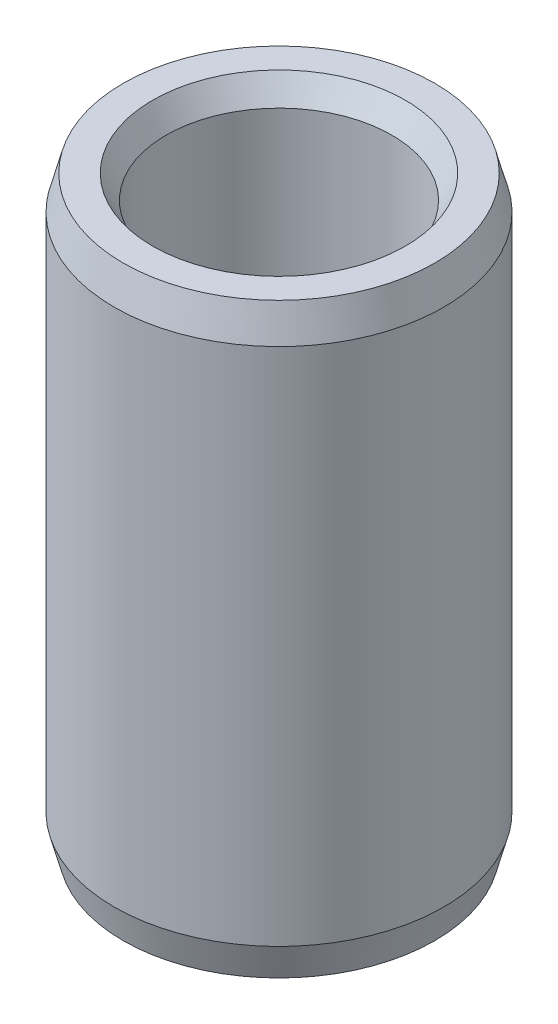
ISO-10303-21;
HEADER;
FILE_DESCRIPTION(('STEP AP214'),'2;1');
FILE_NAME('part.step','',(''),(''),'','','');
FILE_SCHEMA(('AUTOMOTIVE_DESIGN { 1 0 10303 214 1 1 1 1 }'));
ENDSEC;
DATA;
#1=APPLICATION_CONTEXT('core data for automotive mechanical design processes');
#2=APPLICATION_PROTOCOL_DEFINITION('international standard','automotive_design',2000,#1);
#3=PRODUCT_CONTEXT('',#1,'mechanical');
#4=PRODUCT('Part','Part','',(#3));
#5=PRODUCT_RELATED_PRODUCT_CATEGORY('part','',(#4));
#6=PRODUCT_DEFINITION_FORMATION('','',#4);
#7=PRODUCT_DEFINITION_CONTEXT('part definition',#1,'design');
#8=PRODUCT_DEFINITION('design','',#6,#7);
#9=PRODUCT_DEFINITION_SHAPE('','',#8);
#10=(LENGTH_UNIT() NAMED_UNIT(*) SI_UNIT(.MILLI.,.METRE.));
#11=(NAMED_UNIT(*) PLANE_ANGLE_UNIT() SI_UNIT($,.RADIAN.));
#12=(NAMED_UNIT(*) SI_UNIT($,.STERADIAN.) SOLID_ANGLE_UNIT());
#13=UNCERTAINTY_MEASURE_WITH_UNIT(LENGTH_MEASURE(1.E-05),#10,'distance_accuracy_value','');
#14=(GEOMETRIC_REPRESENTATION_CONTEXT(3) GLOBAL_UNCERTAINTY_ASSIGNED_CONTEXT((#13)) GLOBAL_UNIT_ASSIGNED_CONTEXT((#10,
#11,#12)) REPRESENTATION_CONTEXT('',''));
#15=CARTESIAN_POINT('',(0.,0.,0.));
#16=DIRECTION('',(0.,0.,1.));
#17=DIRECTION('',(1.,0.,0.));
#18=AXIS2_PLACEMENT_3D('',#15,#16,#17);
#19=CARTESIAN_POINT('',(0.,-130.,0.));
#20=DIRECTION('',(0.,1.,0.));
#21=DIRECTION('',(0.,0.,1.));
#22=AXIS2_PLACEMENT_3D('',#19,#20,#21);
#23=CYLINDRICAL_SURFACE('',#22,36.5);
#24=CARTESIAN_POINT('',(0.,-7.46410161513802,0.));
#25=DIRECTION('',(0.,1.,0.));
#26=DIRECTION('',(0.,0.,1.));
#27=AXIS2_PLACEMENT_3D('',#24,#25,#26);
#28=CIRCLE('',#27,36.5);
#29=CARTESIAN_POINT('',(0.,-7.46410161513802,36.5));
#30=VERTEX_POINT('',#29);
#31=EDGE_CURVE('E10',#30,#30,#28,.F.);
#32=ORIENTED_EDGE('',*,*,#31,.T.);
#33=EDGE_LOOP('',(#32));
#34=FACE_BOUND('',#33,.T.);
#35=CARTESIAN_POINT('',(0.,-122.535898384862,0.));
#36=DIRECTION('',(0.,1.,0.));
#37=DIRECTION('',(0.,0.,1.));
#38=AXIS2_PLACEMENT_3D('',#35,#36,#37);
#39=CIRCLE('',#38,36.5);
#40=CARTESIAN_POINT('',(0.,-122.535898384862,36.5));
#41=VERTEX_POINT('',#40);
#42=EDGE_CURVE('E55',#41,#41,#39,.T.);
#43=ORIENTED_EDGE('',*,*,#42,.T.);
#44=EDGE_LOOP('',(#43));
#45=FACE_BOUND('',#44,.T.);
#46=ADVANCED_FACE('F39',(#34,#45),#23,.T.);
#47=CARTESIAN_POINT('',(0.,-130.,0.));
#48=DIRECTION('',(0.,1.,0.));
#49=DIRECTION('',(0.,0.,1.));
#50=AXIS2_PLACEMENT_3D('',#47,#48,#49);
#51=PLANE('',#50);
#52=CARTESIAN_POINT('',(0.,-130.,0.));
#53=DIRECTION('',(0.,1.,0.));
#54=DIRECTION('',(0.,0.,1.));
#55=AXIS2_PLACEMENT_3D('',#52,#53,#54);
#56=CIRCLE('',#55,34.5);
#57=CARTESIAN_POINT('',(0.,-130.,34.5));
#58=VERTEX_POINT('',#57);
#59=EDGE_CURVE('E51',#58,#58,#56,.F.);
#60=ORIENTED_EDGE('',*,*,#59,.T.);
#61=EDGE_LOOP('',(#60));
#62=FACE_BOUND('',#61,.T.);
#63=CARTESIAN_POINT('',(0.,-130.,0.));
#64=DIRECTION('',(0.,1.,0.));
#65=DIRECTION('',(0.,0.,1.));
#66=AXIS2_PLACEMENT_3D('',#63,#64,#65);
#67=CIRCLE('',#66,30.1961524227066);
#68=CARTESIAN_POINT('',(0.,-130.,30.1961524227066));
#69=VERTEX_POINT('',#68);
#70=EDGE_CURVE('E69',#69,#69,#67,.T.);
#71=ORIENTED_EDGE('',*,*,#70,.T.);
#72=EDGE_LOOP('',(#71));
#73=FACE_BOUND('',#72,.T.);
#74=ADVANCED_FACE('F73',(#62,#73),#51,.F.);
#75=CARTESIAN_POINT('',(0.,0.,0.));
#76=DIRECTION('',(0.,1.,0.));
#77=DIRECTION('',(0.,0.,1.));
#78=AXIS2_PLACEMENT_3D('',#75,#76,#77);
#79=PLANE('',#78);
#80=CARTESIAN_POINT('',(0.,0.,0.));
#81=DIRECTION('',(0.,1.,0.));
#82=DIRECTION('',(0.,0.,1.));
#83=AXIS2_PLACEMENT_3D('',#80,#81,#82);
#84=CIRCLE('',#83,34.4999999999999);
#85=CARTESIAN_POINT('',(0.,0.,34.4999999999999));
#86=VERTEX_POINT('',#85);
#87=EDGE_CURVE('E47',#86,#86,#84,.T.);
#88=ORIENTED_EDGE('',*,*,#87,.T.);
#89=EDGE_LOOP('',(#88));
#90=FACE_BOUND('',#89,.T.);
#91=CARTESIAN_POINT('',(0.,0.,0.));
#92=DIRECTION('',(0.,1.,0.));
#93=DIRECTION('',(0.,0.,1.));
#94=AXIS2_PLACEMENT_3D('',#91,#92,#93);
#95=CIRCLE('',#94,28.);
#96=CARTESIAN_POINT('',(0.,0.,28.));
#97=VERTEX_POINT('',#96);
#98=EDGE_CURVE('E60',#97,#97,#95,.F.);
#99=ORIENTED_EDGE('',*,*,#98,.T.);
#100=EDGE_LOOP('',(#99));
#101=FACE_BOUND('',#100,.T.);
#102=ADVANCED_FACE('F88',(#90,#101),#79,.T.);
#103=CARTESIAN_POINT('',(0.,-130.,0.));
#104=DIRECTION('',(0.,1.,0.));
#105=DIRECTION('',(0.,0.,1.));
#106=AXIS2_PLACEMENT_3D('',#103,#104,#105);
#107=CYLINDRICAL_SURFACE('',#106,25.);
#108=CARTESIAN_POINT('',(0.,-127.,0.));
#109=DIRECTION('',(0.,1.,0.));
#110=DIRECTION('',(0.,0.,1.));
#111=AXIS2_PLACEMENT_3D('',#108,#109,#110);
#112=CIRCLE('',#111,25.);
#113=CARTESIAN_POINT('',(0.,-127.,25.));
#114=VERTEX_POINT('',#113);
#115=EDGE_CURVE('E63',#114,#114,#112,.F.);
#116=ORIENTED_EDGE('',*,*,#115,.T.);
#117=EDGE_LOOP('',(#116));
#118=FACE_BOUND('',#117,.T.);
#119=CARTESIAN_POINT('',(0.,-5.19615242270664,0.));
#120=DIRECTION('',(0.,1.,0.));
#121=DIRECTION('',(0.,0.,1.));
#122=AXIS2_PLACEMENT_3D('',#119,#120,#121);
#123=CIRCLE('',#122,25.);
#124=CARTESIAN_POINT('',(0.,-5.19615242270664,25.));
#125=VERTEX_POINT('',#124);
#126=EDGE_CURVE('E66',#125,#125,#123,.T.);
#127=ORIENTED_EDGE('',*,*,#126,.T.);
#128=EDGE_LOOP('',(#127));
#129=FACE_BOUND('',#128,.T.);
#130=ADVANCED_FACE('F78',(#118,#129),#107,.F.);
#131=CARTESIAN_POINT('',(0.,-130.,0.));
#132=DIRECTION('',(0.,-1.,0.));
#133=DIRECTION('',(0.,0.,-1.));
#134=AXIS2_PLACEMENT_3D('',#131,#132,#133);
#135=CONICAL_SURFACE('',#134,30.1961524227066,1.0471975511966);
#136=ORIENTED_EDGE('',*,*,#115,.F.);
#137=EDGE_LOOP('',(#136));
#138=FACE_BOUND('',#137,.T.);
#139=ORIENTED_EDGE('',*,*,#70,.F.);
#140=EDGE_LOOP('',(#139));
#141=FACE_BOUND('',#140,.T.);
#142=ADVANCED_FACE('F75',(#138,#141),#135,.F.);
#143=CARTESIAN_POINT('',(0.,-5.19615242270664,0.));
#144=DIRECTION('',(0.,1.,0.));
#145=DIRECTION('',(0.,0.,1.));
#146=AXIS2_PLACEMENT_3D('',#143,#144,#145);
#147=CONICAL_SURFACE('',#146,25.,0.523598775598301);
#148=ORIENTED_EDGE('',*,*,#98,.F.);
#149=EDGE_LOOP('',(#148));
#150=FACE_BOUND('',#149,.T.);
#151=ORIENTED_EDGE('',*,*,#126,.F.);
#152=EDGE_LOOP('',(#151));
#153=FACE_BOUND('',#152,.T.);
#154=ADVANCED_FACE('F77',(#150,#153),#147,.F.);
#155=CARTESIAN_POINT('',(0.,-122.535898384862,0.));
#156=DIRECTION('',(0.,1.,0.));
#157=DIRECTION('',(0.,0.,1.));
#158=AXIS2_PLACEMENT_3D('',#155,#156,#157);
#159=CONICAL_SURFACE('',#158,36.5,0.261799387799146);
#160=CARTESIAN_POINT('',(0.,-130.,34.5));
#161=CARTESIAN_POINT('',(0.,-129.922248941509,34.5208333333333));
#162=CARTESIAN_POINT('',(0.,-129.844497883018,34.5416666666667));
#163=CARTESIAN_POINT('',(0.,-129.688995766036,34.5833333333333));
#164=CARTESIAN_POINT('',(0.,-129.611244707545,34.6041666666667));
#165=CARTESIAN_POINT('',(0.,-129.455742590563,34.6458333333333));
#166=CARTESIAN_POINT('',(0.,-129.377991532072,34.6666666666667));
#167=CARTESIAN_POINT('',(0.,-129.22248941509,34.7083333333333));
#168=CARTESIAN_POINT('',(0.,-129.144738356599,34.7291666666667));
#169=CARTESIAN_POINT('',(0.,-128.989236239617,34.7708333333333));
#170=CARTESIAN_POINT('',(0.,-128.911485181126,34.7916666666667));
#171=CARTESIAN_POINT('',(0.,-128.755983064144,34.8333333333333));
#172=CARTESIAN_POINT('',(0.,-128.678232005653,34.8541666666667));
#173=CARTESIAN_POINT('',(0.,-128.522729888671,34.8958333333333));
#174=CARTESIAN_POINT('',(0.,-128.44497883018,34.9166666666667));
#175=CARTESIAN_POINT('',(0.,-128.289476713198,34.9583333333333));
#176=CARTESIAN_POINT('',(0.,-128.211725654707,34.9791666666667));
#177=CARTESIAN_POINT('',(0.,-128.056223537725,35.0208333333333));
#178=CARTESIAN_POINT('',(0.,-127.978472479234,35.0416666666667));
#179=CARTESIAN_POINT('',(0.,-127.822970362251,35.0833333333333));
#180=CARTESIAN_POINT('',(0.,-127.74521930376,35.1041666666667));
#181=CARTESIAN_POINT('',(0.,-127.589717186778,35.1458333333333));
#182=CARTESIAN_POINT('',(0.,-127.511966128287,35.1666666666667));
#183=CARTESIAN_POINT('',(0.,-127.356464011305,35.2083333333333));
#184=CARTESIAN_POINT('',(0.,-127.278712952814,35.2291666666667));
#185=CARTESIAN_POINT('',(0.,-127.123210835832,35.2708333333333));
#186=CARTESIAN_POINT('',(0.,-127.045459777341,35.2916666666667));
#187=CARTESIAN_POINT('',(0.,-126.889957660359,35.3333333333333));
#188=CARTESIAN_POINT('',(0.,-126.812206601868,35.3541666666667));
#189=CARTESIAN_POINT('',(0.,-126.656704484886,35.3958333333333));
#190=CARTESIAN_POINT('',(0.,-126.578953426395,35.4166666666667));
#191=CARTESIAN_POINT('',(0.,-126.423451309413,35.4583333333333));
#192=CARTESIAN_POINT('',(0.,-126.345700250922,35.4791666666667));
#193=CARTESIAN_POINT('',(0.,-126.19019813394,35.5208333333333));
#194=CARTESIAN_POINT('',(0.,-126.112447075449,35.5416666666667));
#195=CARTESIAN_POINT('',(0.,-125.956944958467,35.5833333333333));
#196=CARTESIAN_POINT('',(0.,-125.879193899976,35.6041666666667));
#197=CARTESIAN_POINT('',(0.,-125.723691782994,35.6458333333333));
#198=CARTESIAN_POINT('',(0.,-125.645940724503,35.6666666666667));
#199=CARTESIAN_POINT('',(0.,-125.490438607521,35.7083333333333));
#200=CARTESIAN_POINT('',(0.,-125.41268754903,35.7291666666667));
#201=CARTESIAN_POINT('',(0.,-125.257185432048,35.7708333333333));
#202=CARTESIAN_POINT('',(0.,-125.179434373557,35.7916666666667));
#203=CARTESIAN_POINT('',(0.,-125.023932256575,35.8333333333333));
#204=CARTESIAN_POINT('',(0.,-124.946181198084,35.8541666666667));
#205=CARTESIAN_POINT('',(0.,-124.790679081102,35.8958333333333));
#206=CARTESIAN_POINT('',(0.,-124.712928022611,35.9166666666667));
#207=CARTESIAN_POINT('',(0.,-124.557425905629,35.9583333333333));
#208=CARTESIAN_POINT('',(0.,-124.479674847138,35.9791666666667));
#209=CARTESIAN_POINT('',(0.,-124.324172730156,36.0208333333333));
#210=CARTESIAN_POINT('',(0.,-124.246421671665,36.0416666666667));
#211=CARTESIAN_POINT('',(0.,-124.090919554683,36.0833333333333));
#212=CARTESIAN_POINT('',(0.,-124.013168496192,36.1041666666667));
#213=CARTESIAN_POINT('',(0.,-123.85766637921,36.1458333333333));
#214=CARTESIAN_POINT('',(0.,-123.779915320718,36.1666666666667));
#215=CARTESIAN_POINT('',(0.,-123.624413203736,36.2083333333333));
#216=CARTESIAN_POINT('',(0.,-123.546662145245,36.2291666666667));
#217=CARTESIAN_POINT('',(0.,-123.391160028263,36.2708333333333));
#218=CARTESIAN_POINT('',(0.,-123.313408969772,36.2916666666667));
#219=CARTESIAN_POINT('',(0.,-123.15790685279,36.3333333333333));
#220=CARTESIAN_POINT('',(0.,-123.080155794299,36.3541666666667));
#221=CARTESIAN_POINT('',(0.,-122.924653677317,36.3958333333333));
#222=CARTESIAN_POINT('',(0.,-122.846902618826,36.4166666666667));
#223=CARTESIAN_POINT('',(0.,-122.691400501844,36.4583333333333));
#224=CARTESIAN_POINT('',(0.,-122.613649443353,36.4791666666667));
#225=CARTESIAN_POINT('',(0.,-122.535898384862,36.5));
#226=B_SPLINE_CURVE_WITH_KNOTS('',3,(#160,#161,#162,#163,#164,#165,#166,#167,#168,#169,#170,
#171,#172,#173,#174,#175,#176,#177,#178,#179,#180,#181,#182,#183,#184,#185,#186,#187,#188,#189,
#190,#191,#192,#193,#194,#195,#196,#197,#198,#199,#200,#201,#202,#203,#204,#205,#206,#207,#208,
#209,#210,#211,#212,#213,#214,#215,#216,#217,#218,#219,#220,#221,#222,#223,#224,#225),
.UNSPECIFIED.,.F.,.F.,(4,2,2,2,2,2,2,2,2,2,2,2,2,2,2,2,2,2,2,2,2,2,2,2,2,2,2,2,2,2,2,2,4),(0.,
0.241481456572281,0.482962913144562,0.724444369716816,0.965925826289098,1.20740728286135,
1.44888873943363,1.69037019600589,1.93185165257817,2.17333310915045,2.4148145657227,
2.65629602229499,2.89777747886724,3.13925893543952,3.38074039201178,3.62222184858406,
3.86370330515634,4.10518476172859,4.34666621830087,4.58814767487313,4.82962913144541,
5.07111058801766,5.31259204458994,5.55407350116221,5.79555495773448,6.03703641430676,
6.27851787087903,6.51999932745129,6.76148078402356,7.00296224059583,7.2444436971681,
7.48592515374037,7.72740661031265),.UNSPECIFIED.);
#227=EDGE_CURVE('BSEAM85',#58,#41,#226,.T.);
#228=ORIENTED_EDGE('',*,*,#59,.F.);
#229=ORIENTED_EDGE('',*,*,#42,.F.);
#230=ORIENTED_EDGE('',*,*,#227,.T.);
#231=ORIENTED_EDGE('',*,*,#227,.F.);
#232=EDGE_LOOP('',(#228,#230,#229,#231));
#233=FACE_BOUND('',#232,.T.);
#234=ADVANCED_FACE('F85',(#233),#159,.T.);
#235=CARTESIAN_POINT('',(0.,0.,0.));
#236=DIRECTION('',(0.,-1.,0.));
#237=DIRECTION('',(0.,0.,-1.));
#238=AXIS2_PLACEMENT_3D('',#235,#236,#237);
#239=CONICAL_SURFACE('',#238,34.4999999999999,0.26179938779915);
#240=ORIENTED_EDGE('',*,*,#31,.F.);
#241=EDGE_LOOP('',(#240));
#242=FACE_BOUND('',#241,.T.);
#243=ORIENTED_EDGE('',*,*,#87,.F.);
#244=EDGE_LOOP('',(#243));
#245=FACE_BOUND('',#244,.T.);
#246=ADVANCED_FACE('F42',(#242,#245),#239,.T.);
#247=CLOSED_SHELL('',(#46,#74,#102,#130,#142,#154,#234,#246));
#248=MANIFOLD_SOLID_BREP('B2',#247);
#249=ADVANCED_BREP_SHAPE_REPRESENTATION('',(#18,#248),#14);
#250=SHAPE_DEFINITION_REPRESENTATION(#9,#249);
ENDSEC;
END-ISO-10303-21;
